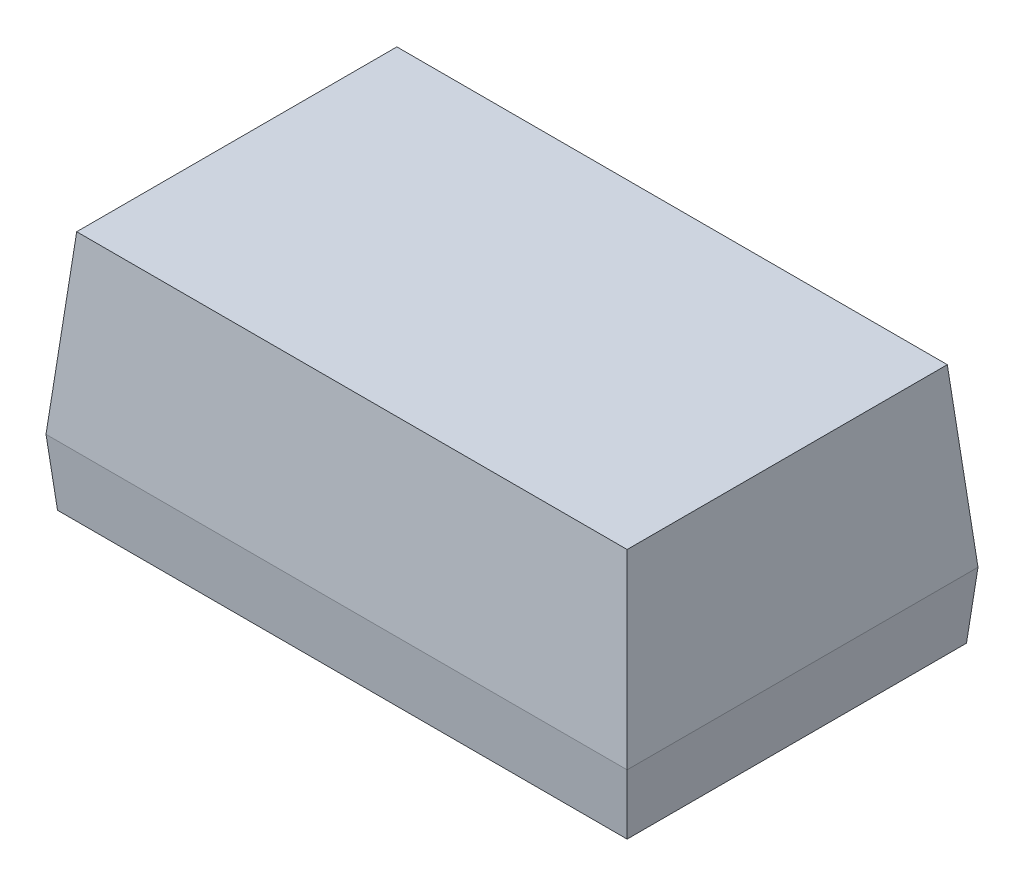
ISO-10303-21;
HEADER;
FILE_DESCRIPTION(('STEP AP214'),'2;1');
FILE_NAME('part.step','',(''),(''),'','','');
FILE_SCHEMA(('AUTOMOTIVE_DESIGN { 1 0 10303 214 1 1 1 1 }'));
ENDSEC;
DATA;
#1=APPLICATION_CONTEXT('core data for automotive mechanical design processes');
#2=APPLICATION_PROTOCOL_DEFINITION('international standard','automotive_design',2000,#1);
#3=PRODUCT_CONTEXT('',#1,'mechanical');
#4=PRODUCT('Part','Part','',(#3));
#5=PRODUCT_RELATED_PRODUCT_CATEGORY('part','',(#4));
#6=PRODUCT_DEFINITION_FORMATION('','',#4);
#7=PRODUCT_DEFINITION_CONTEXT('part definition',#1,'design');
#8=PRODUCT_DEFINITION('design','',#6,#7);
#9=PRODUCT_DEFINITION_SHAPE('','',#8);
#10=(LENGTH_UNIT() NAMED_UNIT(*) SI_UNIT(.MILLI.,.METRE.));
#11=(NAMED_UNIT(*) PLANE_ANGLE_UNIT() SI_UNIT($,.RADIAN.));
#12=(NAMED_UNIT(*) SI_UNIT($,.STERADIAN.) SOLID_ANGLE_UNIT());
#13=UNCERTAINTY_MEASURE_WITH_UNIT(LENGTH_MEASURE(1.E-05),#10,'distance_accuracy_value','');
#14=(GEOMETRIC_REPRESENTATION_CONTEXT(3) GLOBAL_UNCERTAINTY_ASSIGNED_CONTEXT((#13)) GLOBAL_UNIT_ASSIGNED_CONTEXT((#10,
#11,#12)) REPRESENTATION_CONTEXT('',''));
#15=CARTESIAN_POINT('',(0.,0.,0.));
#16=DIRECTION('',(0.,0.,1.));
#17=DIRECTION('',(1.,0.,0.));
#18=AXIS2_PLACEMENT_3D('',#15,#16,#17);
#19=CARTESIAN_POINT('',(1.325,0.,-0.799999999999999));
#20=DIRECTION('',(0.996194698091746,-0.0871557427476582,0.));
#21=DIRECTION('',(0.0871557427476582,0.996194698091746,0.));
#22=AXIS2_PLACEMENT_3D('',#19,#20,#21);
#23=PLANE('',#22);
#24=DIRECTION('',(0.,0.,-1.));
#25=VECTOR('',#24,1.);
#26=CARTESIAN_POINT('',(1.325,0.,-0.799999999999999));
#27=LINE('',#26,#25);
#28=CARTESIAN_POINT('',(1.325,0.,0.8));
#29=VERTEX_POINT('',#28);
#30=CARTESIAN_POINT('',(1.325,0.,-0.799999999999999));
#31=VERTEX_POINT('',#30);
#32=EDGE_CURVE('E96',#29,#31,#27,.T.);
#33=ORIENTED_EDGE('',*,*,#32,.F.);
#34=DIRECTION('',(0.0868265938642476,0.992432509138967,0.0868265938642477));
#35=VECTOR('',#34,1.);
#36=CARTESIAN_POINT('',(1.30502202788452,-0.228349266183016,0.780022027884522));
#37=LINE('',#36,#35);
#38=CARTESIAN_POINT('',(1.29875340094222,-0.3,0.773753400942223));
#39=VERTEX_POINT('',#38);
#40=EDGE_CURVE('E11',#39,#29,#37,.T.);
#41=ORIENTED_EDGE('',*,*,#40,.F.);
#42=DIRECTION('',(0.,0.,-1.));
#43=VECTOR('',#42,1.);
#44=CARTESIAN_POINT('',(1.29875340094222,-0.3,0.));
#45=LINE('',#44,#43);
#46=CARTESIAN_POINT('',(1.29875340094222,-0.3,-0.773753400942222));
#47=VERTEX_POINT('',#46);
#48=EDGE_CURVE('E119',#39,#47,#45,.T.);
#49=ORIENTED_EDGE('',*,*,#48,.T.);
#50=DIRECTION('',(0.0868265938642477,0.992432509138967,-0.0868265938642477));
#51=VECTOR('',#50,1.);
#52=CARTESIAN_POINT('',(1.325,0.,-0.799999999999999));
#53=LINE('',#52,#51);
#54=EDGE_CURVE('E74',#47,#31,#53,.T.);
#55=ORIENTED_EDGE('',*,*,#54,.T.);
#56=EDGE_LOOP('',(#33,#41,#49,#55));
#57=FACE_BOUND('',#56,.T.);
#58=ADVANCED_FACE('F37',(#57),#23,.T.);
#59=CARTESIAN_POINT('',(-1.325,0.,0.799999999999999));
#60=DIRECTION('',(0.,-0.0871557427476582,0.996194698091746));
#61=DIRECTION('',(0.,-0.996194698091746,-0.0871557427476582));
#62=AXIS2_PLACEMENT_3D('',#59,#60,#61);
#63=PLANE('',#62);
#64=DIRECTION('',(1.,0.,0.));
#65=VECTOR('',#64,1.);
#66=CARTESIAN_POINT('',(-1.325,0.,0.799999999999999));
#67=LINE('',#66,#65);
#68=CARTESIAN_POINT('',(-1.325,0.,0.799999999999999));
#69=VERTEX_POINT('',#68);
#70=EDGE_CURVE('E106',#69,#29,#67,.T.);
#71=ORIENTED_EDGE('',*,*,#70,.F.);
#72=DIRECTION('',(-0.0868265938642476,0.992432509138967,0.0868265938642476));
#73=VECTOR('',#72,1.);
#74=CARTESIAN_POINT('',(-1.31293782815669,-0.137871255053896,0.787937828156692));
#75=LINE('',#74,#73);
#76=CARTESIAN_POINT('',(-1.29875340094222,-0.3,0.773753400942221));
#77=VERTEX_POINT('',#76);
#78=EDGE_CURVE('E47',#77,#69,#75,.T.);
#79=ORIENTED_EDGE('',*,*,#78,.F.);
#80=DIRECTION('',(1.,0.,0.));
#81=VECTOR('',#80,1.);
#82=CARTESIAN_POINT('',(0.,-0.3,0.773753400942222));
#83=LINE('',#82,#81);
#84=EDGE_CURVE('E109',#77,#39,#83,.T.);
#85=ORIENTED_EDGE('',*,*,#84,.T.);
#86=ORIENTED_EDGE('',*,*,#40,.T.);
#87=EDGE_LOOP('',(#71,#79,#85,#86));
#88=FACE_BOUND('',#87,.T.);
#89=ADVANCED_FACE('F39',(#88),#63,.T.);
#90=CARTESIAN_POINT('',(-1.325,0.,-0.799999999999999));
#91=DIRECTION('',(-0.996194698091746,-0.0871557427476582,0.));
#92=DIRECTION('',(0.0871557427476582,-0.996194698091746,0.));
#93=AXIS2_PLACEMENT_3D('',#90,#91,#92);
#94=PLANE('',#93);
#95=DIRECTION('',(0.,0.,1.));
#96=VECTOR('',#95,1.);
#97=CARTESIAN_POINT('',(-1.325,0.,-0.799999999999999));
#98=LINE('',#97,#96);
#99=CARTESIAN_POINT('',(-1.325,0.,-0.799999999999999));
#100=VERTEX_POINT('',#99);
#101=EDGE_CURVE('E120',#100,#69,#98,.T.);
#102=ORIENTED_EDGE('',*,*,#101,.F.);
#103=DIRECTION('',(-0.0868265938642477,0.992432509138967,-0.0868265938642476));
#104=VECTOR('',#103,1.);
#105=CARTESIAN_POINT('',(-1.325,0.,-0.799999999999999));
#106=LINE('',#105,#104);
#107=CARTESIAN_POINT('',(-1.29875340094222,-0.3,-0.773753400942222));
#108=VERTEX_POINT('',#107);
#109=EDGE_CURVE('E67',#108,#100,#106,.T.);
#110=ORIENTED_EDGE('',*,*,#109,.F.);
#111=DIRECTION('',(0.,0.,1.));
#112=VECTOR('',#111,1.);
#113=CARTESIAN_POINT('',(-1.29875340094222,-0.3,0.));
#114=LINE('',#113,#112);
#115=EDGE_CURVE('E146',#108,#77,#114,.T.);
#116=ORIENTED_EDGE('',*,*,#115,.T.);
#117=ORIENTED_EDGE('',*,*,#78,.T.);
#118=EDGE_LOOP('',(#102,#110,#116,#117));
#119=FACE_BOUND('',#118,.T.);
#120=ADVANCED_FACE('F158',(#119),#94,.T.);
#121=CARTESIAN_POINT('',(-1.325,0.,-0.799999999999999));
#122=DIRECTION('',(0.,-0.0871557427476582,-0.996194698091746));
#123=DIRECTION('',(0.,0.996194698091746,-0.0871557427476582));
#124=AXIS2_PLACEMENT_3D('',#121,#122,#123);
#125=PLANE('',#124);
#126=DIRECTION('',(-1.,0.,0.));
#127=VECTOR('',#126,1.);
#128=CARTESIAN_POINT('',(-1.325,0.,-0.799999999999999));
#129=LINE('',#128,#127);
#130=EDGE_CURVE('E100',#31,#100,#129,.T.);
#131=ORIENTED_EDGE('',*,*,#130,.F.);
#132=ORIENTED_EDGE('',*,*,#54,.F.);
#133=DIRECTION('',(-1.,0.,0.));
#134=VECTOR('',#133,1.);
#135=CARTESIAN_POINT('',(0.,-0.3,-0.773753400942222));
#136=LINE('',#135,#134);
#137=EDGE_CURVE('E41',#47,#108,#136,.T.);
#138=ORIENTED_EDGE('',*,*,#137,.T.);
#139=ORIENTED_EDGE('',*,*,#109,.T.);
#140=EDGE_LOOP('',(#131,#132,#138,#139));
#141=FACE_BOUND('',#140,.T.);
#142=ADVANCED_FACE('F147',(#141),#125,.T.);
#143=CARTESIAN_POINT('',(0.,-0.3,0.));
#144=DIRECTION('',(0.,1.,0.));
#145=DIRECTION('',(0.,0.,1.));
#146=AXIS2_PLACEMENT_3D('',#143,#144,#145);
#147=PLANE('',#146);
#148=ORIENTED_EDGE('',*,*,#48,.F.);
#149=ORIENTED_EDGE('',*,*,#84,.F.);
#150=ORIENTED_EDGE('',*,*,#115,.F.);
#151=ORIENTED_EDGE('',*,*,#137,.F.);
#152=EDGE_LOOP('',(#148,#149,#150,#151));
#153=FACE_BOUND('',#152,.T.);
#154=ADVANCED_FACE('F149',(#153),#147,.F.);
#155=CARTESIAN_POINT('',(1.325,0.,-0.799999999999999));
#156=DIRECTION('',(0.996194698091746,0.0871557427476582,0.));
#157=DIRECTION('',(-0.0871557427476582,0.996194698091746,0.));
#158=AXIS2_PLACEMENT_3D('',#155,#156,#157);
#159=PLANE('',#158);
#160=ORIENTED_EDGE('',*,*,#32,.T.);
#161=DIRECTION('',(0.0868265938642477,-0.992432509138967,-0.0868265938642477));
#162=VECTOR('',#161,1.);
#163=CARTESIAN_POINT('',(1.30502202788452,0.228349266183016,-0.780022027884522));
#164=LINE('',#163,#162);
#165=CARTESIAN_POINT('',(1.25500906917926,0.8,-0.73000906917926));
#166=VERTEX_POINT('',#165);
#167=EDGE_CURVE('E101',#166,#31,#164,.T.);
#168=ORIENTED_EDGE('',*,*,#167,.F.);
#169=DIRECTION('',(0.,0.,1.));
#170=VECTOR('',#169,1.);
#171=CARTESIAN_POINT('',(1.25500906917926,0.8,-0.799999999999999));
#172=LINE('',#171,#170);
#173=CARTESIAN_POINT('',(1.25500906917926,0.8,0.730009069179261));
#174=VERTEX_POINT('',#173);
#175=EDGE_CURVE('E124',#174,#166,#172,.F.);
#176=ORIENTED_EDGE('',*,*,#175,.F.);
#177=DIRECTION('',(0.0868265938642476,-0.992432509138967,0.0868265938642477));
#178=VECTOR('',#177,1.);
#179=CARTESIAN_POINT('',(1.31293782815669,0.137871255053897,0.787937828156693));
#180=LINE('',#179,#178);
#181=EDGE_CURVE('E115',#174,#29,#180,.T.);
#182=ORIENTED_EDGE('',*,*,#181,.T.);
#183=EDGE_LOOP('',(#160,#168,#176,#182));
#184=FACE_BOUND('',#183,.T.);
#185=ADVANCED_FACE('F122',(#184),#159,.T.);
#186=CARTESIAN_POINT('',(-1.325,0.,-0.799999999999999));
#187=DIRECTION('',(0.,0.0871557427476582,-0.996194698091746));
#188=DIRECTION('',(0.,0.996194698091746,0.0871557427476582));
#189=AXIS2_PLACEMENT_3D('',#186,#187,#188);
#190=PLANE('',#189);
#191=ORIENTED_EDGE('',*,*,#130,.T.);
#192=DIRECTION('',(-0.0868265938642477,-0.992432509138967,-0.0868265938642476));
#193=VECTOR('',#192,1.);
#194=CARTESIAN_POINT('',(-1.325,0.,-0.799999999999999));
#195=LINE('',#194,#193);
#196=CARTESIAN_POINT('',(-1.25500906917926,0.8,-0.73000906917926));
#197=VERTEX_POINT('',#196);
#198=EDGE_CURVE('E127',#197,#100,#195,.T.);
#199=ORIENTED_EDGE('',*,*,#198,.F.);
#200=DIRECTION('',(1.,0.,0.));
#201=VECTOR('',#200,1.);
#202=CARTESIAN_POINT('',(-1.325,0.8,-0.73000906917926));
#203=LINE('',#202,#201);
#204=EDGE_CURVE('E136',#166,#197,#203,.F.);
#205=ORIENTED_EDGE('',*,*,#204,.F.);
#206=ORIENTED_EDGE('',*,*,#167,.T.);
#207=EDGE_LOOP('',(#191,#199,#205,#206));
#208=FACE_BOUND('',#207,.T.);
#209=ADVANCED_FACE('F156',(#208),#190,.T.);
#210=CARTESIAN_POINT('',(-1.325,0.,-0.799999999999999));
#211=DIRECTION('',(-0.996194698091746,0.0871557427476582,0.));
#212=DIRECTION('',(-0.0871557427476582,-0.996194698091746,0.));
#213=AXIS2_PLACEMENT_3D('',#210,#211,#212);
#214=PLANE('',#213);
#215=ORIENTED_EDGE('',*,*,#101,.T.);
#216=DIRECTION('',(-0.0868265938642476,-0.992432509138967,0.0868265938642476));
#217=VECTOR('',#216,1.);
#218=CARTESIAN_POINT('',(-1.325,0.,0.799999999999999));
#219=LINE('',#218,#217);
#220=CARTESIAN_POINT('',(-1.25500906917926,0.8,0.730009069179259));
#221=VERTEX_POINT('',#220);
#222=EDGE_CURVE('E118',#221,#69,#219,.T.);
#223=ORIENTED_EDGE('',*,*,#222,.F.);
#224=DIRECTION('',(0.,0.,-1.));
#225=VECTOR('',#224,1.);
#226=CARTESIAN_POINT('',(-1.25500906917926,0.8,-0.799999999999999));
#227=LINE('',#226,#225);
#228=EDGE_CURVE('E129',#197,#221,#227,.F.);
#229=ORIENTED_EDGE('',*,*,#228,.F.);
#230=ORIENTED_EDGE('',*,*,#198,.T.);
#231=EDGE_LOOP('',(#215,#223,#229,#230));
#232=FACE_BOUND('',#231,.T.);
#233=ADVANCED_FACE('F174',(#232),#214,.T.);
#234=CARTESIAN_POINT('',(-1.325,0.,0.799999999999999));
#235=DIRECTION('',(0.,0.0871557427476582,0.996194698091746));
#236=DIRECTION('',(0.,-0.996194698091746,0.0871557427476582));
#237=AXIS2_PLACEMENT_3D('',#234,#235,#236);
#238=PLANE('',#237);
#239=ORIENTED_EDGE('',*,*,#70,.T.);
#240=ORIENTED_EDGE('',*,*,#181,.F.);
#241=DIRECTION('',(-1.,0.,0.));
#242=VECTOR('',#241,1.);
#243=CARTESIAN_POINT('',(-1.325,0.8,0.730009069179259));
#244=LINE('',#243,#242);
#245=EDGE_CURVE('E125',#221,#174,#244,.F.);
#246=ORIENTED_EDGE('',*,*,#245,.F.);
#247=ORIENTED_EDGE('',*,*,#222,.T.);
#248=EDGE_LOOP('',(#239,#240,#246,#247));
#249=FACE_BOUND('',#248,.T.);
#250=ADVANCED_FACE('F113',(#249),#238,.T.);
#251=CARTESIAN_POINT('',(0.,0.8,0.));
#252=DIRECTION('',(0.,1.,0.));
#253=DIRECTION('',(0.,0.,1.));
#254=AXIS2_PLACEMENT_3D('',#251,#252,#253);
#255=PLANE('',#254);
#256=ORIENTED_EDGE('',*,*,#175,.T.);
#257=ORIENTED_EDGE('',*,*,#204,.T.);
#258=ORIENTED_EDGE('',*,*,#228,.T.);
#259=ORIENTED_EDGE('',*,*,#245,.T.);
#260=EDGE_LOOP('',(#256,#257,#258,#259));
#261=FACE_BOUND('',#260,.T.);
#262=ADVANCED_FACE('F176',(#261),#255,.T.);
#263=CLOSED_SHELL('',(#58,#89,#120,#142,#154,#185,#209,#233,#250,#262));
#264=MANIFOLD_SOLID_BREP('B2',#263);
#265=ADVANCED_BREP_SHAPE_REPRESENTATION('',(#18,#264),#14);
#266=SHAPE_DEFINITION_REPRESENTATION(#9,#265);
ENDSEC;
END-ISO-10303-21;
